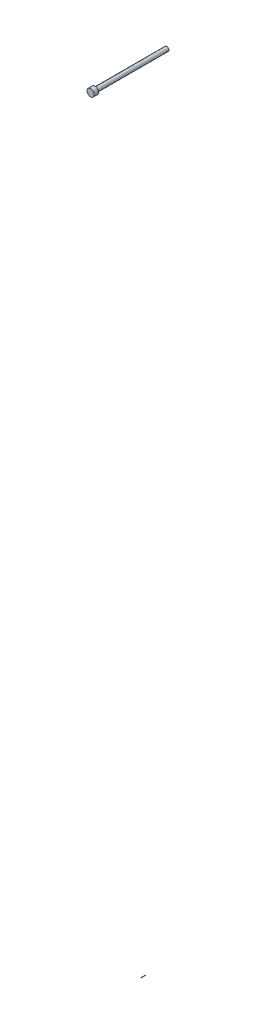
ISO-10303-21;
HEADER;
FILE_DESCRIPTION(('STEP AP214'),'2;1');
FILE_NAME('part.step','',(''),(''),'','','');
FILE_SCHEMA(('AUTOMOTIVE_DESIGN { 1 0 10303 214 1 1 1 1 }'));
ENDSEC;
DATA;
#1=APPLICATION_CONTEXT('core data for automotive mechanical design processes');
#2=APPLICATION_PROTOCOL_DEFINITION('international standard','automotive_design',2000,#1);
#3=PRODUCT_CONTEXT('',#1,'mechanical');
#4=PRODUCT('Part','Part','',(#3));
#5=PRODUCT_RELATED_PRODUCT_CATEGORY('part','',(#4));
#6=PRODUCT_DEFINITION_FORMATION('','',#4);
#7=PRODUCT_DEFINITION_CONTEXT('part definition',#1,'design');
#8=PRODUCT_DEFINITION('design','',#6,#7);
#9=PRODUCT_DEFINITION_SHAPE('','',#8);
#10=(LENGTH_UNIT() NAMED_UNIT(*) SI_UNIT(.MILLI.,.METRE.));
#11=(NAMED_UNIT(*) PLANE_ANGLE_UNIT() SI_UNIT($,.RADIAN.));
#12=(NAMED_UNIT(*) SI_UNIT($,.STERADIAN.) SOLID_ANGLE_UNIT());
#13=UNCERTAINTY_MEASURE_WITH_UNIT(LENGTH_MEASURE(1.E-05),#10,'distance_accuracy_value','');
#14=(GEOMETRIC_REPRESENTATION_CONTEXT(3) GLOBAL_UNCERTAINTY_ASSIGNED_CONTEXT((#13)) GLOBAL_UNIT_ASSIGNED_CONTEXT((#10,
#11,#12)) REPRESENTATION_CONTEXT('',''));
#15=CARTESIAN_POINT('',(0.,0.,0.));
#16=DIRECTION('',(0.,0.,1.));
#17=DIRECTION('',(1.,0.,0.));
#18=AXIS2_PLACEMENT_3D('',#15,#16,#17);
#19=CARTESIAN_POINT('',(3.52392811112101E-13,515.930000000001,3.));
#20=DIRECTION('',(0.,0.,-1.));
#21=DIRECTION('',(-1.,0.,0.));
#22=AXIS2_PLACEMENT_3D('',#19,#20,#21);
#23=CYLINDRICAL_SURFACE('',#22,2.5);
#24=CARTESIAN_POINT('',(3.52392811112101E-13,515.930000000001,3.));
#25=DIRECTION('',(0.,0.,1.));
#26=DIRECTION('',(1.,0.,0.));
#27=AXIS2_PLACEMENT_3D('',#24,#25,#26);
#28=CIRCLE('',#27,2.5);
#29=CARTESIAN_POINT('',(2.50000000000035,515.930000000001,3.));
#30=VERTEX_POINT('',#29);
#31=EDGE_CURVE('E46',#30,#30,#28,.T.);
#32=ORIENTED_EDGE('',*,*,#31,.F.);
#33=EDGE_LOOP('',(#32));
#34=FACE_BOUND('',#33,.T.);
#35=CARTESIAN_POINT('',(3.52392811112101E-13,515.930000000001,0.));
#36=DIRECTION('',(0.,0.,1.));
#37=DIRECTION('',(1.,0.,0.));
#38=AXIS2_PLACEMENT_3D('',#35,#36,#37);
#39=CIRCLE('',#38,2.5);
#40=CARTESIAN_POINT('',(2.50000000000035,515.930000000001,0.));
#41=VERTEX_POINT('',#40);
#42=EDGE_CURVE('E42',#41,#41,#39,.T.);
#43=ORIENTED_EDGE('',*,*,#42,.T.);
#44=EDGE_LOOP('',(#43));
#45=FACE_BOUND('',#44,.T.);
#46=ADVANCED_FACE('F39',(#34,#45),#23,.T.);
#47=CARTESIAN_POINT('',(3.52392811112101E-13,515.930000000001,3.));
#48=DIRECTION('',(0.,0.,1.));
#49=DIRECTION('',(1.,0.,0.));
#50=AXIS2_PLACEMENT_3D('',#47,#48,#49);
#51=PLANE('',#50);
#52=ORIENTED_EDGE('',*,*,#31,.T.);
#53=EDGE_LOOP('',(#52));
#54=FACE_BOUND('',#53,.T.);
#55=ADVANCED_FACE('F63',(#54),#51,.T.);
#56=CARTESIAN_POINT('',(3.52392811112101E-13,515.930000000001,0.));
#57=DIRECTION('',(0.,0.,1.));
#58=DIRECTION('',(1.,0.,0.));
#59=AXIS2_PLACEMENT_3D('',#56,#57,#58);
#60=PLANE('',#59);
#61=CARTESIAN_POINT('',(3.52392811112101E-13,515.930000000001,0.));
#62=DIRECTION('',(0.,0.,-1.));
#63=DIRECTION('',(-1.,0.,0.));
#64=AXIS2_PLACEMENT_3D('',#61,#62,#63);
#65=CIRCLE('',#64,1.5);
#66=CARTESIAN_POINT('',(-1.49999999999965,515.930000000001,0.));
#67=VERTEX_POINT('',#66);
#68=EDGE_CURVE('E11',#67,#67,#65,.T.);
#69=ORIENTED_EDGE('',*,*,#68,.F.);
#70=EDGE_LOOP('',(#69));
#71=FACE_BOUND('',#70,.T.);
#72=ORIENTED_EDGE('',*,*,#42,.F.);
#73=EDGE_LOOP('',(#72));
#74=FACE_BOUND('',#73,.T.);
#75=ADVANCED_FACE('F60',(#71,#74),#60,.F.);
#76=CARTESIAN_POINT('',(3.52392811112101E-13,515.930000000001,-50.));
#77=DIRECTION('',(0.,0.,1.));
#78=DIRECTION('',(1.,0.,0.));
#79=AXIS2_PLACEMENT_3D('',#76,#77,#78);
#80=CYLINDRICAL_SURFACE('',#79,1.5);
#81=CARTESIAN_POINT('',(3.52392811112101E-13,515.930000000001,-50.));
#82=DIRECTION('',(0.,0.,-1.));
#83=DIRECTION('',(-1.,0.,0.));
#84=AXIS2_PLACEMENT_3D('',#81,#82,#83);
#85=CIRCLE('',#84,1.5);
#86=CARTESIAN_POINT('',(-1.49999999999965,515.930000000001,-50.));
#87=VERTEX_POINT('',#86);
#88=EDGE_CURVE('E52',#87,#87,#85,.T.);
#89=ORIENTED_EDGE('',*,*,#88,.F.);
#90=EDGE_LOOP('',(#89));
#91=FACE_BOUND('',#90,.T.);
#92=ORIENTED_EDGE('',*,*,#68,.T.);
#93=EDGE_LOOP('',(#92));
#94=FACE_BOUND('',#93,.T.);
#95=ADVANCED_FACE('F62',(#91,#94),#80,.T.);
#96=CARTESIAN_POINT('',(3.52392811112101E-13,515.930000000001,-50.));
#97=DIRECTION('',(0.,0.,-1.));
#98=DIRECTION('',(-1.,0.,0.));
#99=AXIS2_PLACEMENT_3D('',#96,#97,#98);
#100=PLANE('',#99);
#101=ORIENTED_EDGE('',*,*,#88,.T.);
#102=EDGE_LOOP('',(#101));
#103=FACE_BOUND('',#102,.T.);
#104=ADVANCED_FACE('F69',(#103),#100,.T.);
#105=CLOSED_SHELL('',(#46,#55,#75,#95,#104));
#106=MANIFOLD_SOLID_BREP('B2',#105);
#107=CARTESIAN_POINT('',(35.,0.,3.));
#108=DIRECTION('',(0.,0.,-1.));
#109=DIRECTION('',(-1.,0.,0.));
#110=AXIS2_PLACEMENT_3D('',#107,#108,#109);
#111=CYLINDRICAL_SURFACE('',#110,0.0811711585386802);
#112=CARTESIAN_POINT('',(35.,0.,3.));
#113=DIRECTION('',(0.,0.,1.));
#114=DIRECTION('',(1.,0.,0.));
#115=AXIS2_PLACEMENT_3D('',#112,#113,#114);
#116=CIRCLE('',#115,0.0811711585386802);
#117=CARTESIAN_POINT('',(35.0811711585387,0.,3.));
#118=VERTEX_POINT('',#117);
#119=EDGE_CURVE('E38',#118,#118,#116,.T.);
#120=ORIENTED_EDGE('',*,*,#119,.F.);
#121=EDGE_LOOP('',(#120));
#122=FACE_BOUND('',#121,.T.);
#123=CARTESIAN_POINT('',(35.,0.,0.));
#124=DIRECTION('',(0.,0.,1.));
#125=DIRECTION('',(1.,0.,0.));
#126=AXIS2_PLACEMENT_3D('',#123,#124,#125);
#127=CIRCLE('',#126,0.0811711585386802);
#128=CARTESIAN_POINT('',(35.0811711585387,0.,0.));
#129=VERTEX_POINT('',#128);
#130=EDGE_CURVE('E113',#129,#129,#127,.T.);
#131=ORIENTED_EDGE('',*,*,#130,.T.);
#132=EDGE_LOOP('',(#131));
#133=FACE_BOUND('',#132,.T.);
#134=ADVANCED_FACE('F110',(#122,#133),#111,.T.);
#135=CARTESIAN_POINT('',(35.,0.,3.));
#136=DIRECTION('',(0.,0.,1.));
#137=DIRECTION('',(1.,0.,0.));
#138=AXIS2_PLACEMENT_3D('',#135,#136,#137);
#139=PLANE('',#138);
#140=ORIENTED_EDGE('',*,*,#119,.T.);
#141=EDGE_LOOP('',(#140));
#142=FACE_BOUND('',#141,.T.);
#143=ADVANCED_FACE('F125',(#142),#139,.T.);
#144=CARTESIAN_POINT('',(35.,0.,0.));
#145=DIRECTION('',(0.,0.,1.));
#146=DIRECTION('',(1.,0.,0.));
#147=AXIS2_PLACEMENT_3D('',#144,#145,#146);
#148=PLANE('',#147);
#149=ORIENTED_EDGE('',*,*,#130,.F.);
#150=EDGE_LOOP('',(#149));
#151=FACE_BOUND('',#150,.T.);
#152=ADVANCED_FACE('F123',(#151),#148,.F.);
#153=CLOSED_SHELL('',(#134,#143,#152));
#154=MANIFOLD_SOLID_BREP('B6',#153);
#155=ADVANCED_BREP_SHAPE_REPRESENTATION('',(#18,#106,#154),#14);
#156=SHAPE_DEFINITION_REPRESENTATION(#9,#155);
ENDSEC;
END-ISO-10303-21;
